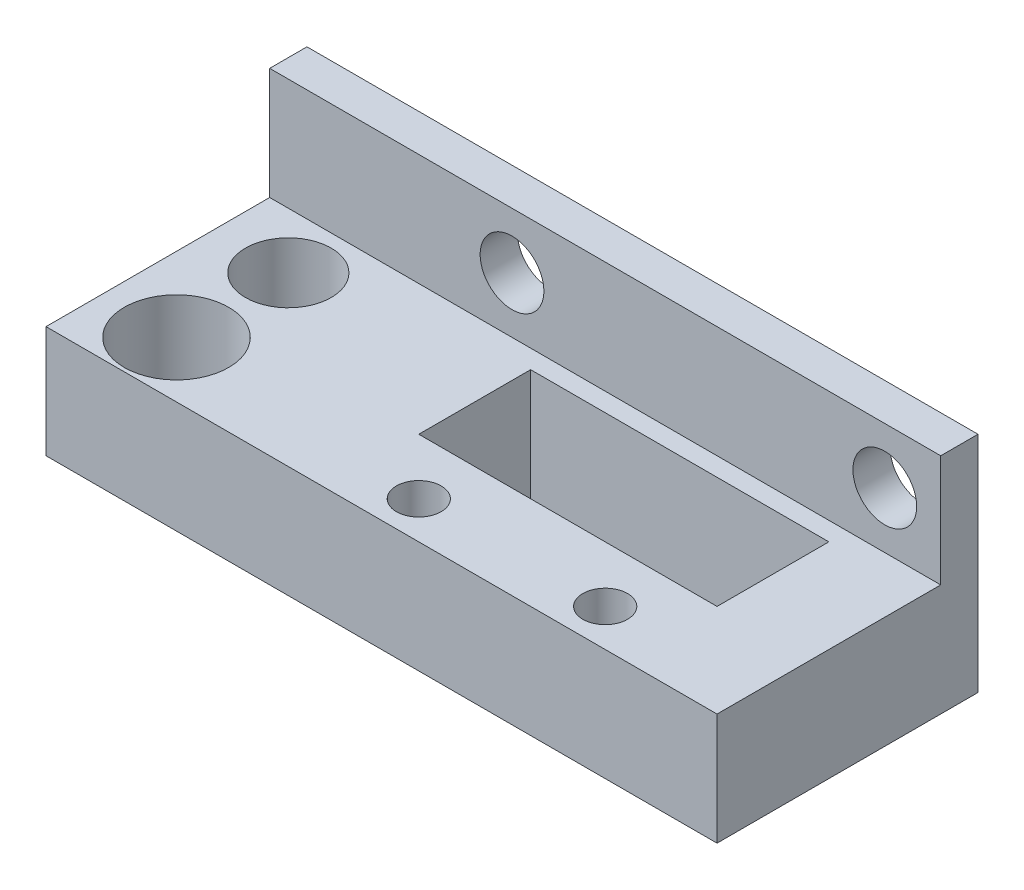
ISO-10303-21;
HEADER;
FILE_DESCRIPTION(('STEP AP214'),'2;1');
FILE_NAME('part.step','',(''),(''),'','','');
FILE_SCHEMA(('AUTOMOTIVE_DESIGN { 1 0 10303 214 1 1 1 1 }'));
ENDSEC;
DATA;
#1=APPLICATION_CONTEXT('core data for automotive mechanical design processes');
#2=APPLICATION_PROTOCOL_DEFINITION('international standard','automotive_design',2000,#1);
#3=PRODUCT_CONTEXT('',#1,'mechanical');
#4=PRODUCT('Part','Part','',(#3));
#5=PRODUCT_RELATED_PRODUCT_CATEGORY('part','',(#4));
#6=PRODUCT_DEFINITION_FORMATION('','',#4);
#7=PRODUCT_DEFINITION_CONTEXT('part definition',#1,'design');
#8=PRODUCT_DEFINITION('design','',#6,#7);
#9=PRODUCT_DEFINITION_SHAPE('','',#8);
#10=(LENGTH_UNIT() NAMED_UNIT(*) SI_UNIT(.MILLI.,.METRE.));
#11=(NAMED_UNIT(*) PLANE_ANGLE_UNIT() SI_UNIT($,.RADIAN.));
#12=(NAMED_UNIT(*) SI_UNIT($,.STERADIAN.) SOLID_ANGLE_UNIT());
#13=UNCERTAINTY_MEASURE_WITH_UNIT(LENGTH_MEASURE(1.E-05),#10,'distance_accuracy_value','');
#14=(GEOMETRIC_REPRESENTATION_CONTEXT(3) GLOBAL_UNCERTAINTY_ASSIGNED_CONTEXT((#13)) GLOBAL_UNIT_ASSIGNED_CONTEXT((#10,
#11,#12)) REPRESENTATION_CONTEXT('',''));
#15=CARTESIAN_POINT('',(0.,0.,0.));
#16=DIRECTION('',(0.,0.,1.));
#17=DIRECTION('',(1.,0.,0.));
#18=AXIS2_PLACEMENT_3D('',#15,#16,#17);
#19=CARTESIAN_POINT('',(-30.3244897959184,7.62,-13.1211734693877));
#20=DIRECTION('',(1.,0.,0.));
#21=DIRECTION('',(0.,0.,-1.));
#22=AXIS2_PLACEMENT_3D('',#19,#20,#21);
#23=PLANE('',#22);
#24=DIRECTION('',(0.,0.,1.));
#25=VECTOR('',#24,1.);
#26=CARTESIAN_POINT('',(-30.3244897959184,0.,-13.1211734693877));
#27=LINE('',#26,#25);
#28=CARTESIAN_POINT('',(-30.3244897959184,0.,-13.1211734693877));
#29=VERTEX_POINT('',#28);
#30=CARTESIAN_POINT('',(-30.3244897959184,0.,4.65882653061225));
#31=VERTEX_POINT('',#30);
#32=EDGE_CURVE('E199',#29,#31,#27,.T.);
#33=ORIENTED_EDGE('',*,*,#32,.T.);
#34=DIRECTION('',(0.,-1.,0.));
#35=VECTOR('',#34,1.);
#36=CARTESIAN_POINT('',(-30.3244897959184,7.62,4.65882653061225));
#37=LINE('',#36,#35);
#38=CARTESIAN_POINT('',(-30.3244897959184,7.62,4.65882653061225));
#39=VERTEX_POINT('',#38);
#40=EDGE_CURVE('E11',#39,#31,#37,.T.);
#41=ORIENTED_EDGE('',*,*,#40,.F.);
#42=DIRECTION('',(0.,0.,1.));
#43=VECTOR('',#42,1.);
#44=CARTESIAN_POINT('',(-30.3244897959184,7.62,-13.1211734693877));
#45=LINE('',#44,#43);
#46=CARTESIAN_POINT('',(-30.3244897959184,7.62,-10.5811734693877));
#47=VERTEX_POINT('',#46);
#48=EDGE_CURVE('E200',#47,#39,#45,.T.);
#49=ORIENTED_EDGE('',*,*,#48,.F.);
#50=DIRECTION('',(0.,-1.,0.));
#51=VECTOR('',#50,1.);
#52=CARTESIAN_POINT('',(-30.3244897959184,15.24,-10.5811734693877));
#53=LINE('',#52,#51);
#54=CARTESIAN_POINT('',(-30.3244897959184,15.24,-10.5811734693877));
#55=VERTEX_POINT('',#54);
#56=EDGE_CURVE('E196',#55,#47,#53,.T.);
#57=ORIENTED_EDGE('',*,*,#56,.F.);
#58=DIRECTION('',(0.,0.,1.));
#59=VECTOR('',#58,1.);
#60=CARTESIAN_POINT('',(-30.3244897959184,15.24,-13.1211734693877));
#61=LINE('',#60,#59);
#62=CARTESIAN_POINT('',(-30.3244897959184,15.24,-13.1211734693877));
#63=VERTEX_POINT('',#62);
#64=EDGE_CURVE('E180',#63,#55,#61,.T.);
#65=ORIENTED_EDGE('',*,*,#64,.F.);
#66=DIRECTION('',(0.,-1.,0.));
#67=VECTOR('',#66,1.);
#68=CARTESIAN_POINT('',(-30.3244897959184,7.62,-13.1211734693877));
#69=LINE('',#68,#67);
#70=EDGE_CURVE('E207',#63,#29,#69,.T.);
#71=ORIENTED_EDGE('',*,*,#70,.T.);
#72=EDGE_LOOP('',(#33,#41,#49,#57,#65,#71));
#73=FACE_BOUND('',#72,.T.);
#74=ADVANCED_FACE('F33',(#73),#23,.F.);
#75=CARTESIAN_POINT('',(-30.3244897959184,7.62,4.65882653061225));
#76=DIRECTION('',(0.,0.,-1.));
#77=DIRECTION('',(-1.,0.,0.));
#78=AXIS2_PLACEMENT_3D('',#75,#76,#77);
#79=PLANE('',#78);
#80=DIRECTION('',(1.,0.,0.));
#81=VECTOR('',#80,1.);
#82=CARTESIAN_POINT('',(-30.3244897959184,0.,4.65882653061225));
#83=LINE('',#82,#81);
#84=CARTESIAN_POINT('',(15.3955102040816,0.,4.65882653061225));
#85=VERTEX_POINT('',#84);
#86=EDGE_CURVE('E210',#31,#85,#83,.T.);
#87=ORIENTED_EDGE('',*,*,#86,.T.);
#88=DIRECTION('',(0.,-1.,0.));
#89=VECTOR('',#88,1.);
#90=CARTESIAN_POINT('',(15.3955102040816,7.62,4.65882653061225));
#91=LINE('',#90,#89);
#92=CARTESIAN_POINT('',(15.3955102040816,7.62,4.65882653061225));
#93=VERTEX_POINT('',#92);
#94=EDGE_CURVE('E40',#93,#85,#91,.T.);
#95=ORIENTED_EDGE('',*,*,#94,.F.);
#96=DIRECTION('',(1.,0.,0.));
#97=VECTOR('',#96,1.);
#98=CARTESIAN_POINT('',(-30.3244897959184,7.62,4.65882653061225));
#99=LINE('',#98,#97);
#100=EDGE_CURVE('E202',#39,#93,#99,.T.);
#101=ORIENTED_EDGE('',*,*,#100,.F.);
#102=ORIENTED_EDGE('',*,*,#40,.T.);
#103=EDGE_LOOP('',(#87,#95,#101,#102));
#104=FACE_BOUND('',#103,.T.);
#105=ADVANCED_FACE('F246',(#104),#79,.F.);
#106=CARTESIAN_POINT('',(15.3955102040816,7.62,-13.1211734693877));
#107=DIRECTION('',(-1.,0.,0.));
#108=DIRECTION('',(0.,0.,1.));
#109=AXIS2_PLACEMENT_3D('',#106,#107,#108);
#110=PLANE('',#109);
#111=DIRECTION('',(0.,0.,-1.));
#112=VECTOR('',#111,1.);
#113=CARTESIAN_POINT('',(15.3955102040816,0.,-13.1211734693877));
#114=LINE('',#113,#112);
#115=CARTESIAN_POINT('',(15.3955102040816,0.,-13.1211734693877));
#116=VERTEX_POINT('',#115);
#117=EDGE_CURVE('E212',#85,#116,#114,.T.);
#118=ORIENTED_EDGE('',*,*,#117,.T.);
#119=DIRECTION('',(0.,-1.,0.));
#120=VECTOR('',#119,1.);
#121=CARTESIAN_POINT('',(15.3955102040816,7.62,-13.1211734693877));
#122=LINE('',#121,#120);
#123=CARTESIAN_POINT('',(15.3955102040816,15.24,-13.1211734693877));
#124=VERTEX_POINT('',#123);
#125=EDGE_CURVE('E217',#124,#116,#122,.T.);
#126=ORIENTED_EDGE('',*,*,#125,.F.);
#127=DIRECTION('',(0.,0.,-1.));
#128=VECTOR('',#127,1.);
#129=CARTESIAN_POINT('',(15.3955102040816,15.24,-13.1211734693877));
#130=LINE('',#129,#128);
#131=CARTESIAN_POINT('',(15.3955102040816,15.24,-10.5811734693877));
#132=VERTEX_POINT('',#131);
#133=EDGE_CURVE('E185',#132,#124,#130,.T.);
#134=ORIENTED_EDGE('',*,*,#133,.F.);
#135=DIRECTION('',(0.,-1.,0.));
#136=VECTOR('',#135,1.);
#137=CARTESIAN_POINT('',(15.3955102040816,15.24,-10.5811734693877));
#138=LINE('',#137,#136);
#139=CARTESIAN_POINT('',(15.3955102040816,7.62,-10.5811734693877));
#140=VERTEX_POINT('',#139);
#141=EDGE_CURVE('E191',#132,#140,#138,.T.);
#142=ORIENTED_EDGE('',*,*,#141,.T.);
#143=DIRECTION('',(0.,0.,-1.));
#144=VECTOR('',#143,1.);
#145=CARTESIAN_POINT('',(15.3955102040816,7.62,-13.1211734693877));
#146=LINE('',#145,#144);
#147=EDGE_CURVE('E205',#93,#140,#146,.T.);
#148=ORIENTED_EDGE('',*,*,#147,.F.);
#149=ORIENTED_EDGE('',*,*,#94,.T.);
#150=EDGE_LOOP('',(#118,#126,#134,#142,#148,#149));
#151=FACE_BOUND('',#150,.T.);
#152=ADVANCED_FACE('F224',(#151),#110,.F.);
#153=CARTESIAN_POINT('',(-30.3244897959184,7.62,-13.1211734693877));
#154=DIRECTION('',(0.,0.,1.));
#155=DIRECTION('',(1.,0.,0.));
#156=AXIS2_PLACEMENT_3D('',#153,#154,#155);
#157=PLANE('',#156);
#158=CARTESIAN_POINT('',(-13.8144897959184,11.43,-13.1211734693877));
#159=DIRECTION('',(0.,0.,-1.));
#160=DIRECTION('',(-1.,0.,0.));
#161=AXIS2_PLACEMENT_3D('',#158,#159,#160);
#162=CIRCLE('',#161,2.1717);
#163=CARTESIAN_POINT('',(-15.9861897959184,11.43,-13.1211734693877));
#164=VERTEX_POINT('',#163);
#165=EDGE_CURVE('E172',#164,#164,#162,.T.);
#166=ORIENTED_EDGE('',*,*,#165,.F.);
#167=EDGE_LOOP('',(#166));
#168=FACE_BOUND('',#167,.T.);
#169=CARTESIAN_POINT('',(11.5855102040816,11.43,-13.1211734693877));
#170=DIRECTION('',(0.,0.,-1.));
#171=DIRECTION('',(-1.,0.,0.));
#172=AXIS2_PLACEMENT_3D('',#169,#170,#171);
#173=CIRCLE('',#172,2.1717);
#174=CARTESIAN_POINT('',(9.41381020408164,11.43,-13.1211734693877));
#175=VERTEX_POINT('',#174);
#176=EDGE_CURVE('E165',#175,#175,#173,.T.);
#177=ORIENTED_EDGE('',*,*,#176,.F.);
#178=EDGE_LOOP('',(#177));
#179=FACE_BOUND('',#178,.T.);
#180=DIRECTION('',(-1.,0.,0.));
#181=VECTOR('',#180,1.);
#182=CARTESIAN_POINT('',(-30.3244897959184,0.,-13.1211734693877));
#183=LINE('',#182,#181);
#184=EDGE_CURVE('E203',#116,#29,#183,.T.);
#185=ORIENTED_EDGE('',*,*,#184,.T.);
#186=ORIENTED_EDGE('',*,*,#70,.F.);
#187=DIRECTION('',(-1.,0.,0.));
#188=VECTOR('',#187,1.);
#189=CARTESIAN_POINT('',(-30.3244897959184,15.24,-13.1211734693877));
#190=LINE('',#189,#188);
#191=EDGE_CURVE('E188',#124,#63,#190,.T.);
#192=ORIENTED_EDGE('',*,*,#191,.F.);
#193=ORIENTED_EDGE('',*,*,#125,.T.);
#194=EDGE_LOOP('',(#185,#186,#192,#193));
#195=FACE_BOUND('',#194,.T.);
#196=ADVANCED_FACE('F231',(#168,#179,#195),#157,.F.);
#197=CARTESIAN_POINT('',(0.,7.62,0.));
#198=DIRECTION('',(0.,1.,0.));
#199=DIRECTION('',(0.,0.,1.));
#200=AXIS2_PLACEMENT_3D('',#197,#198,#199);
#201=PLANE('',#200);
#202=CARTESIAN_POINT('',(-25.2444897959184,7.62,-6.77117346938775));
#203=DIRECTION('',(0.,1.,0.));
#204=DIRECTION('',(0.,0.,1.));
#205=AXIS2_PLACEMENT_3D('',#202,#203,#204);
#206=CIRCLE('',#205,2.921);
#207=CARTESIAN_POINT('',(-25.2444897959184,7.62,-3.85017346938775));
#208=VERTEX_POINT('',#207);
#209=EDGE_CURVE('E152',#208,#208,#206,.T.);
#210=ORIENTED_EDGE('',*,*,#209,.F.);
#211=EDGE_LOOP('',(#210));
#212=FACE_BOUND('',#211,.T.);
#213=CARTESIAN_POINT('',(-7.46448979591836,7.62,2.11882653061225));
#214=DIRECTION('',(0.,1.,0.));
#215=DIRECTION('',(0.,0.,1.));
#216=AXIS2_PLACEMENT_3D('',#213,#214,#215);
#217=CIRCLE('',#216,1.524);
#218=CARTESIAN_POINT('',(-7.46448979591836,7.62,3.64282653061225));
#219=VERTEX_POINT('',#218);
#220=EDGE_CURVE('E158',#219,#219,#217,.T.);
#221=ORIENTED_EDGE('',*,*,#220,.F.);
#222=EDGE_LOOP('',(#221));
#223=FACE_BOUND('',#222,.T.);
#224=CARTESIAN_POINT('',(5.23551020408164,7.62,2.11882653061225));
#225=DIRECTION('',(0.,1.,0.));
#226=DIRECTION('',(0.,0.,1.));
#227=AXIS2_PLACEMENT_3D('',#224,#225,#226);
#228=CIRCLE('',#227,1.524);
#229=CARTESIAN_POINT('',(5.23551020408164,7.62,3.64282653061225));
#230=VERTEX_POINT('',#229);
#231=EDGE_CURVE('E133',#230,#230,#228,.T.);
#232=ORIENTED_EDGE('',*,*,#231,.F.);
#233=EDGE_LOOP('',(#232));
#234=FACE_BOUND('',#233,.T.);
#235=DIRECTION('',(0.,0.,1.));
#236=VECTOR('',#235,1.);
#237=CARTESIAN_POINT('',(-11.2744897959184,7.62,-9.31117346938775));
#238=LINE('',#237,#236);
#239=CARTESIAN_POINT('',(-11.2744897959184,7.62,-9.31117346938775));
#240=VERTEX_POINT('',#239);
#241=CARTESIAN_POINT('',(-11.2744897959184,7.62,-1.69117346938775));
#242=VERTEX_POINT('',#241);
#243=EDGE_CURVE('E47',#240,#242,#238,.T.);
#244=ORIENTED_EDGE('',*,*,#243,.F.);
#245=DIRECTION('',(-1.,0.,0.));
#246=VECTOR('',#245,1.);
#247=CARTESIAN_POINT('',(-11.2744897959184,7.62,-9.31117346938775));
#248=LINE('',#247,#246);
#249=CARTESIAN_POINT('',(9.04551020408164,7.62,-9.31117346938775));
#250=VERTEX_POINT('',#249);
#251=EDGE_CURVE('E127',#250,#240,#248,.T.);
#252=ORIENTED_EDGE('',*,*,#251,.F.);
#253=DIRECTION('',(0.,0.,-1.));
#254=VECTOR('',#253,1.);
#255=CARTESIAN_POINT('',(9.04551020408164,7.62,-9.31117346938775));
#256=LINE('',#255,#254);
#257=CARTESIAN_POINT('',(9.04551020408164,7.62,-1.69117346938775));
#258=VERTEX_POINT('',#257);
#259=EDGE_CURVE('E130',#258,#250,#256,.T.);
#260=ORIENTED_EDGE('',*,*,#259,.F.);
#261=DIRECTION('',(1.,0.,0.));
#262=VECTOR('',#261,1.);
#263=CARTESIAN_POINT('',(-11.2744897959184,7.62,-1.69117346938775));
#264=LINE('',#263,#262);
#265=EDGE_CURVE('E139',#242,#258,#264,.T.);
#266=ORIENTED_EDGE('',*,*,#265,.F.);
#267=EDGE_LOOP('',(#244,#252,#260,#266));
#268=FACE_BOUND('',#267,.T.);
#269=CARTESIAN_POINT('',(-25.2444897959184,7.62,0.848826530612249));
#270=DIRECTION('',(0.,1.,0.));
#271=DIRECTION('',(0.,0.,1.));
#272=AXIS2_PLACEMENT_3D('',#269,#270,#271);
#273=CIRCLE('',#272,3.556);
#274=CARTESIAN_POINT('',(-25.2444897959184,7.62,4.40482653061225));
#275=VERTEX_POINT('',#274);
#276=EDGE_CURVE('E151',#275,#275,#273,.T.);
#277=ORIENTED_EDGE('',*,*,#276,.F.);
#278=EDGE_LOOP('',(#277));
#279=FACE_BOUND('',#278,.T.);
#280=DIRECTION('',(1.,0.,0.));
#281=VECTOR('',#280,1.);
#282=CARTESIAN_POINT('',(-30.3244897959184,7.62,-10.5811734693877));
#283=LINE('',#282,#281);
#284=EDGE_CURVE('E171',#47,#140,#283,.T.);
#285=ORIENTED_EDGE('',*,*,#284,.F.);
#286=ORIENTED_EDGE('',*,*,#48,.T.);
#287=ORIENTED_EDGE('',*,*,#100,.T.);
#288=ORIENTED_EDGE('',*,*,#147,.T.);
#289=EDGE_LOOP('',(#285,#286,#287,#288));
#290=FACE_BOUND('',#289,.T.);
#291=ADVANCED_FACE('F245',(#212,#223,#234,#268,#279,#290),#201,.T.);
#292=CARTESIAN_POINT('',(0.,0.,0.));
#293=DIRECTION('',(0.,1.,0.));
#294=DIRECTION('',(0.,0.,1.));
#295=AXIS2_PLACEMENT_3D('',#292,#293,#294);
#296=PLANE('',#295);
#297=CARTESIAN_POINT('',(-25.2444897959184,0.,-6.77117346938775));
#298=DIRECTION('',(0.,1.,0.));
#299=DIRECTION('',(0.,0.,1.));
#300=AXIS2_PLACEMENT_3D('',#297,#298,#299);
#301=CIRCLE('',#300,2.921);
#302=CARTESIAN_POINT('',(-25.2444897959184,0.,-3.85017346938775));
#303=VERTEX_POINT('',#302);
#304=EDGE_CURVE('E148',#303,#303,#301,.T.);
#305=ORIENTED_EDGE('',*,*,#304,.T.);
#306=EDGE_LOOP('',(#305));
#307=FACE_BOUND('',#306,.T.);
#308=CARTESIAN_POINT('',(-7.46448979591836,0.,2.11882653061225));
#309=DIRECTION('',(0.,1.,0.));
#310=DIRECTION('',(0.,0.,1.));
#311=AXIS2_PLACEMENT_3D('',#308,#309,#310);
#312=CIRCLE('',#311,1.524);
#313=CARTESIAN_POINT('',(-7.46448979591836,0.,3.64282653061225));
#314=VERTEX_POINT('',#313);
#315=EDGE_CURVE('E155',#314,#314,#312,.T.);
#316=ORIENTED_EDGE('',*,*,#315,.T.);
#317=EDGE_LOOP('',(#316));
#318=FACE_BOUND('',#317,.T.);
#319=CARTESIAN_POINT('',(5.23551020408164,0.,2.11882653061225));
#320=DIRECTION('',(0.,1.,0.));
#321=DIRECTION('',(0.,0.,1.));
#322=AXIS2_PLACEMENT_3D('',#319,#320,#321);
#323=CIRCLE('',#322,1.524);
#324=CARTESIAN_POINT('',(5.23551020408164,0.,3.64282653061225));
#325=VERTEX_POINT('',#324);
#326=EDGE_CURVE('E161',#325,#325,#323,.T.);
#327=ORIENTED_EDGE('',*,*,#326,.T.);
#328=EDGE_LOOP('',(#327));
#329=FACE_BOUND('',#328,.T.);
#330=DIRECTION('',(-1.,0.,0.));
#331=VECTOR('',#330,1.);
#332=CARTESIAN_POINT('',(-11.2744897959184,0.,-9.31117346938775));
#333=LINE('',#332,#331);
#334=CARTESIAN_POINT('',(9.04551020408164,0.,-9.31117346938775));
#335=VERTEX_POINT('',#334);
#336=CARTESIAN_POINT('',(-11.2744897959184,0.,-9.31117346938775));
#337=VERTEX_POINT('',#336);
#338=EDGE_CURVE('E117',#335,#337,#333,.T.);
#339=ORIENTED_EDGE('',*,*,#338,.T.);
#340=DIRECTION('',(0.,0.,1.));
#341=VECTOR('',#340,1.);
#342=CARTESIAN_POINT('',(-11.2744897959184,0.,-9.31117346938775));
#343=LINE('',#342,#341);
#344=CARTESIAN_POINT('',(-11.2744897959184,0.,-1.69117346938775));
#345=VERTEX_POINT('',#344);
#346=EDGE_CURVE('E111',#337,#345,#343,.T.);
#347=ORIENTED_EDGE('',*,*,#346,.T.);
#348=DIRECTION('',(1.,0.,0.));
#349=VECTOR('',#348,1.);
#350=CARTESIAN_POINT('',(-11.2744897959184,0.,-1.69117346938775));
#351=LINE('',#350,#349);
#352=CARTESIAN_POINT('',(9.04551020408164,0.,-1.69117346938775));
#353=VERTEX_POINT('',#352);
#354=EDGE_CURVE('E120',#345,#353,#351,.T.);
#355=ORIENTED_EDGE('',*,*,#354,.T.);
#356=DIRECTION('',(0.,0.,-1.));
#357=VECTOR('',#356,1.);
#358=CARTESIAN_POINT('',(9.04551020408164,0.,-9.31117346938775));
#359=LINE('',#358,#357);
#360=EDGE_CURVE('E55',#353,#335,#359,.T.);
#361=ORIENTED_EDGE('',*,*,#360,.T.);
#362=EDGE_LOOP('',(#339,#347,#355,#361));
#363=FACE_BOUND('',#362,.T.);
#364=CARTESIAN_POINT('',(-25.2444897959184,0.,0.848826530612249));
#365=DIRECTION('',(0.,1.,0.));
#366=DIRECTION('',(0.,0.,1.));
#367=AXIS2_PLACEMENT_3D('',#364,#365,#366);
#368=CIRCLE('',#367,3.556);
#369=CARTESIAN_POINT('',(-25.2444897959184,0.,4.40482653061225));
#370=VERTEX_POINT('',#369);
#371=EDGE_CURVE('E162',#370,#370,#368,.T.);
#372=ORIENTED_EDGE('',*,*,#371,.T.);
#373=EDGE_LOOP('',(#372));
#374=FACE_BOUND('',#373,.T.);
#375=ORIENTED_EDGE('',*,*,#32,.F.);
#376=ORIENTED_EDGE('',*,*,#184,.F.);
#377=ORIENTED_EDGE('',*,*,#117,.F.);
#378=ORIENTED_EDGE('',*,*,#86,.F.);
#379=EDGE_LOOP('',(#375,#376,#377,#378));
#380=FACE_BOUND('',#379,.T.);
#381=ADVANCED_FACE('F124',(#307,#318,#329,#363,#374,#380),#296,.F.);
#382=CARTESIAN_POINT('',(-30.3244897959184,15.24,-10.5811734693877));
#383=DIRECTION('',(0.,0.,-1.));
#384=DIRECTION('',(-1.,0.,0.));
#385=AXIS2_PLACEMENT_3D('',#382,#383,#384);
#386=PLANE('',#385);
#387=CARTESIAN_POINT('',(-13.8144897959184,11.43,-10.5811734693877));
#388=DIRECTION('',(0.,0.,-1.));
#389=DIRECTION('',(-1.,0.,0.));
#390=AXIS2_PLACEMENT_3D('',#387,#388,#389);
#391=CIRCLE('',#390,2.1717);
#392=CARTESIAN_POINT('',(-15.9861897959184,11.43,-10.5811734693877));
#393=VERTEX_POINT('',#392);
#394=EDGE_CURVE('E168',#393,#393,#391,.T.);
#395=ORIENTED_EDGE('',*,*,#394,.T.);
#396=EDGE_LOOP('',(#395));
#397=FACE_BOUND('',#396,.T.);
#398=CARTESIAN_POINT('',(11.5855102040816,11.43,-10.5811734693877));
#399=DIRECTION('',(0.,0.,-1.));
#400=DIRECTION('',(-1.,0.,0.));
#401=AXIS2_PLACEMENT_3D('',#398,#399,#400);
#402=CIRCLE('',#401,2.1717);
#403=CARTESIAN_POINT('',(9.41381020408164,11.43,-10.5811734693877));
#404=VERTEX_POINT('',#403);
#405=EDGE_CURVE('E175',#404,#404,#402,.T.);
#406=ORIENTED_EDGE('',*,*,#405,.T.);
#407=EDGE_LOOP('',(#406));
#408=FACE_BOUND('',#407,.T.);
#409=ORIENTED_EDGE('',*,*,#284,.T.);
#410=ORIENTED_EDGE('',*,*,#141,.F.);
#411=DIRECTION('',(1.,0.,0.));
#412=VECTOR('',#411,1.);
#413=CARTESIAN_POINT('',(-30.3244897959184,15.24,-10.5811734693877));
#414=LINE('',#413,#412);
#415=EDGE_CURVE('E183',#55,#132,#414,.T.);
#416=ORIENTED_EDGE('',*,*,#415,.F.);
#417=ORIENTED_EDGE('',*,*,#56,.T.);
#418=EDGE_LOOP('',(#409,#410,#416,#417));
#419=FACE_BOUND('',#418,.T.);
#420=ADVANCED_FACE('F243',(#397,#408,#419),#386,.F.);
#421=CARTESIAN_POINT('',(0.,15.24,0.));
#422=DIRECTION('',(0.,1.,0.));
#423=DIRECTION('',(0.,0.,1.));
#424=AXIS2_PLACEMENT_3D('',#421,#422,#423);
#425=PLANE('',#424);
#426=ORIENTED_EDGE('',*,*,#64,.T.);
#427=ORIENTED_EDGE('',*,*,#415,.T.);
#428=ORIENTED_EDGE('',*,*,#133,.T.);
#429=ORIENTED_EDGE('',*,*,#191,.T.);
#430=EDGE_LOOP('',(#426,#427,#428,#429));
#431=FACE_BOUND('',#430,.T.);
#432=ADVANCED_FACE('F239',(#431),#425,.T.);
#433=CARTESIAN_POINT('',(11.5855102040816,11.43,-10.5811734693877));
#434=DIRECTION('',(0.,0.,-1.));
#435=DIRECTION('',(-1.,0.,0.));
#436=AXIS2_PLACEMENT_3D('',#433,#434,#435);
#437=CYLINDRICAL_SURFACE('',#436,2.1717);
#438=ORIENTED_EDGE('',*,*,#405,.F.);
#439=EDGE_LOOP('',(#438));
#440=FACE_BOUND('',#439,.T.);
#441=ORIENTED_EDGE('',*,*,#176,.T.);
#442=EDGE_LOOP('',(#441));
#443=FACE_BOUND('',#442,.T.);
#444=ADVANCED_FACE('F268',(#440,#443),#437,.F.);
#445=CARTESIAN_POINT('',(-13.8144897959184,11.43,-10.5811734693877));
#446=DIRECTION('',(0.,0.,-1.));
#447=DIRECTION('',(-1.,0.,0.));
#448=AXIS2_PLACEMENT_3D('',#445,#446,#447);
#449=CYLINDRICAL_SURFACE('',#448,2.1717);
#450=ORIENTED_EDGE('',*,*,#394,.F.);
#451=EDGE_LOOP('',(#450));
#452=FACE_BOUND('',#451,.T.);
#453=ORIENTED_EDGE('',*,*,#165,.T.);
#454=EDGE_LOOP('',(#453));
#455=FACE_BOUND('',#454,.T.);
#456=ADVANCED_FACE('F271',(#452,#455),#449,.F.);
#457=CARTESIAN_POINT('',(-25.2444897959184,0.,0.848826530612249));
#458=DIRECTION('',(0.,1.,0.));
#459=DIRECTION('',(0.,0.,1.));
#460=AXIS2_PLACEMENT_3D('',#457,#458,#459);
#461=CYLINDRICAL_SURFACE('',#460,3.556);
#462=CARTESIAN_POINT('',(-25.2444897959184,0.,4.40482653061225));
#463=CARTESIAN_POINT('',(-25.2444897959184,0.0793749999999998,4.40482653061225));
#464=CARTESIAN_POINT('',(-25.2444897959184,0.15875,4.40482653061225));
#465=CARTESIAN_POINT('',(-25.2444897959184,0.3175,4.40482653061225));
#466=CARTESIAN_POINT('',(-25.2444897959184,0.396875,4.40482653061225));
#467=CARTESIAN_POINT('',(-25.2444897959184,0.555625,4.40482653061225));
#468=CARTESIAN_POINT('',(-25.2444897959184,0.635,4.40482653061225));
#469=CARTESIAN_POINT('',(-25.2444897959184,0.79375,4.40482653061225));
#470=CARTESIAN_POINT('',(-25.2444897959184,0.873125,4.40482653061225));
#471=CARTESIAN_POINT('',(-25.2444897959184,1.031875,4.40482653061225));
#472=CARTESIAN_POINT('',(-25.2444897959184,1.11125,4.40482653061225));
#473=CARTESIAN_POINT('',(-25.2444897959184,1.27,4.40482653061225));
#474=CARTESIAN_POINT('',(-25.2444897959184,1.349375,4.40482653061225));
#475=CARTESIAN_POINT('',(-25.2444897959184,1.508125,4.40482653061225));
#476=CARTESIAN_POINT('',(-25.2444897959184,1.5875,4.40482653061225));
#477=CARTESIAN_POINT('',(-25.2444897959184,1.74625,4.40482653061225));
#478=CARTESIAN_POINT('',(-25.2444897959184,1.825625,4.40482653061225));
#479=CARTESIAN_POINT('',(-25.2444897959184,1.984375,4.40482653061225));
#480=CARTESIAN_POINT('',(-25.2444897959184,2.06375,4.40482653061225));
#481=CARTESIAN_POINT('',(-25.2444897959184,2.2225,4.40482653061225));
#482=CARTESIAN_POINT('',(-25.2444897959184,2.301875,4.40482653061225));
#483=CARTESIAN_POINT('',(-25.2444897959184,2.460625,4.40482653061225));
#484=CARTESIAN_POINT('',(-25.2444897959184,2.54,4.40482653061225));
#485=CARTESIAN_POINT('',(-25.2444897959184,2.69875,4.40482653061225));
#486=CARTESIAN_POINT('',(-25.2444897959184,2.778125,4.40482653061225));
#487=CARTESIAN_POINT('',(-25.2444897959184,2.936875,4.40482653061225));
#488=CARTESIAN_POINT('',(-25.2444897959184,3.01625,4.40482653061225));
#489=CARTESIAN_POINT('',(-25.2444897959184,3.175,4.40482653061225));
#490=CARTESIAN_POINT('',(-25.2444897959184,3.254375,4.40482653061225));
#491=CARTESIAN_POINT('',(-25.2444897959184,3.413125,4.40482653061225));
#492=CARTESIAN_POINT('',(-25.2444897959184,3.4925,4.40482653061225));
#493=CARTESIAN_POINT('',(-25.2444897959184,3.65125,4.40482653061225));
#494=CARTESIAN_POINT('',(-25.2444897959184,3.730625,4.40482653061225));
#495=CARTESIAN_POINT('',(-25.2444897959184,3.889375,4.40482653061225));
#496=CARTESIAN_POINT('',(-25.2444897959184,3.96875,4.40482653061225));
#497=CARTESIAN_POINT('',(-25.2444897959184,4.1275,4.40482653061225));
#498=CARTESIAN_POINT('',(-25.2444897959184,4.206875,4.40482653061225));
#499=CARTESIAN_POINT('',(-25.2444897959184,4.365625,4.40482653061225));
#500=CARTESIAN_POINT('',(-25.2444897959184,4.445,4.40482653061225));
#501=CARTESIAN_POINT('',(-25.2444897959184,4.60375,4.40482653061225));
#502=CARTESIAN_POINT('',(-25.2444897959184,4.683125,4.40482653061225));
#503=CARTESIAN_POINT('',(-25.2444897959184,4.841875,4.40482653061225));
#504=CARTESIAN_POINT('',(-25.2444897959184,4.92125,4.40482653061225));
#505=CARTESIAN_POINT('',(-25.2444897959184,5.08,4.40482653061225));
#506=CARTESIAN_POINT('',(-25.2444897959184,5.159375,4.40482653061225));
#507=CARTESIAN_POINT('',(-25.2444897959184,5.318125,4.40482653061225));
#508=CARTESIAN_POINT('',(-25.2444897959184,5.3975,4.40482653061225));
#509=CARTESIAN_POINT('',(-25.2444897959184,5.55625,4.40482653061225));
#510=CARTESIAN_POINT('',(-25.2444897959184,5.635625,4.40482653061225));
#511=CARTESIAN_POINT('',(-25.2444897959184,5.794375,4.40482653061225));
#512=CARTESIAN_POINT('',(-25.2444897959184,5.87375,4.40482653061225));
#513=CARTESIAN_POINT('',(-25.2444897959184,6.0325,4.40482653061225));
#514=CARTESIAN_POINT('',(-25.2444897959184,6.111875,4.40482653061225));
#515=CARTESIAN_POINT('',(-25.2444897959184,6.270625,4.40482653061225));
#516=CARTESIAN_POINT('',(-25.2444897959184,6.35,4.40482653061225));
#517=CARTESIAN_POINT('',(-25.2444897959184,6.50875,4.40482653061225));
#518=CARTESIAN_POINT('',(-25.2444897959184,6.588125,4.40482653061225));
#519=CARTESIAN_POINT('',(-25.2444897959184,6.746875,4.40482653061225));
#520=CARTESIAN_POINT('',(-25.2444897959184,6.82625,4.40482653061225));
#521=CARTESIAN_POINT('',(-25.2444897959184,6.985,4.40482653061225));
#522=CARTESIAN_POINT('',(-25.2444897959184,7.064375,4.40482653061225));
#523=CARTESIAN_POINT('',(-25.2444897959184,7.223125,4.40482653061225));
#524=CARTESIAN_POINT('',(-25.2444897959184,7.3025,4.40482653061225));
#525=CARTESIAN_POINT('',(-25.2444897959184,7.46125,4.40482653061225));
#526=CARTESIAN_POINT('',(-25.2444897959184,7.540625,4.40482653061225));
#527=CARTESIAN_POINT('',(-25.2444897959184,7.62,4.40482653061225));
#528=B_SPLINE_CURVE_WITH_KNOTS('',3,(#462,#463,#464,#465,#466,#467,#468,#469,#470,#471,#472,
#473,#474,#475,#476,#477,#478,#479,#480,#481,#482,#483,#484,#485,#486,#487,#488,#489,#490,#491,
#492,#493,#494,#495,#496,#497,#498,#499,#500,#501,#502,#503,#504,#505,#506,#507,#508,#509,#510,
#511,#512,#513,#514,#515,#516,#517,#518,#519,#520,#521,#522,#523,#524,#525,#526,#527),
.UNSPECIFIED.,.F.,.F.,(4,2,2,2,2,2,2,2,2,2,2,2,2,2,2,2,2,2,2,2,2,2,2,2,2,2,2,2,2,2,2,2,4),(0.,
0.238125,0.47625,0.714375,0.9525,1.190625,1.42875,1.666875,1.905,2.143125,2.38125,2.619375,
2.8575,3.095625,3.33375,3.571875,3.81,4.048125,4.28625,4.524375,4.7625,5.000625,5.23875,
5.476875,5.715,5.953125,6.19125,6.429375,6.6675,6.905625,7.14375,7.381875,7.62),.UNSPECIFIED.);
#529=EDGE_CURVE('BSEAM275',#370,#275,#528,.T.);
#530=ORIENTED_EDGE('',*,*,#371,.F.);
#531=ORIENTED_EDGE('',*,*,#276,.T.);
#532=ORIENTED_EDGE('',*,*,#529,.T.);
#533=ORIENTED_EDGE('',*,*,#529,.F.);
#534=EDGE_LOOP('',(#530,#532,#531,#533));
#535=FACE_BOUND('',#534,.T.);
#536=ADVANCED_FACE('F275',(#535),#461,.F.);
#537=CARTESIAN_POINT('',(-11.2744897959184,0.,-9.31117346938775));
#538=DIRECTION('',(-1.,0.,0.));
#539=DIRECTION('',(0.,0.,1.));
#540=AXIS2_PLACEMENT_3D('',#537,#538,#539);
#541=PLANE('',#540);
#542=ORIENTED_EDGE('',*,*,#243,.T.);
#543=DIRECTION('',(0.,1.,0.));
#544=VECTOR('',#543,1.);
#545=CARTESIAN_POINT('',(-11.2744897959184,0.,-1.69117346938775));
#546=LINE('',#545,#544);
#547=EDGE_CURVE('E107',#345,#242,#546,.T.);
#548=ORIENTED_EDGE('',*,*,#547,.F.);
#549=ORIENTED_EDGE('',*,*,#346,.F.);
#550=DIRECTION('',(0.,1.,0.));
#551=VECTOR('',#550,1.);
#552=CARTESIAN_POINT('',(-11.2744897959184,0.,-9.31117346938775));
#553=LINE('',#552,#551);
#554=EDGE_CURVE('E143',#337,#240,#553,.T.);
#555=ORIENTED_EDGE('',*,*,#554,.T.);
#556=EDGE_LOOP('',(#542,#548,#549,#555));
#557=FACE_BOUND('',#556,.T.);
#558=ADVANCED_FACE('F109',(#557),#541,.F.);
#559=CARTESIAN_POINT('',(-11.2744897959184,0.,-9.31117346938775));
#560=DIRECTION('',(0.,0.,-1.));
#561=DIRECTION('',(-1.,0.,0.));
#562=AXIS2_PLACEMENT_3D('',#559,#560,#561);
#563=PLANE('',#562);
#564=ORIENTED_EDGE('',*,*,#251,.T.);
#565=ORIENTED_EDGE('',*,*,#554,.F.);
#566=ORIENTED_EDGE('',*,*,#338,.F.);
#567=DIRECTION('',(0.,1.,0.));
#568=VECTOR('',#567,1.);
#569=CARTESIAN_POINT('',(9.04551020408164,0.,-9.31117346938775));
#570=LINE('',#569,#568);
#571=EDGE_CURVE('E145',#335,#250,#570,.T.);
#572=ORIENTED_EDGE('',*,*,#571,.T.);
#573=EDGE_LOOP('',(#564,#565,#566,#572));
#574=FACE_BOUND('',#573,.T.);
#575=ADVANCED_FACE('F291',(#574),#563,.F.);
#576=CARTESIAN_POINT('',(9.04551020408164,0.,-9.31117346938775));
#577=DIRECTION('',(1.,0.,0.));
#578=DIRECTION('',(0.,0.,-1.));
#579=AXIS2_PLACEMENT_3D('',#576,#577,#578);
#580=PLANE('',#579);
#581=ORIENTED_EDGE('',*,*,#259,.T.);
#582=ORIENTED_EDGE('',*,*,#571,.F.);
#583=ORIENTED_EDGE('',*,*,#360,.F.);
#584=DIRECTION('',(0.,1.,0.));
#585=VECTOR('',#584,1.);
#586=CARTESIAN_POINT('',(9.04551020408164,0.,-1.69117346938775));
#587=LINE('',#586,#585);
#588=EDGE_CURVE('E116',#353,#258,#587,.T.);
#589=ORIENTED_EDGE('',*,*,#588,.T.);
#590=EDGE_LOOP('',(#581,#582,#583,#589));
#591=FACE_BOUND('',#590,.T.);
#592=ADVANCED_FACE('F294',(#591),#580,.F.);
#593=CARTESIAN_POINT('',(-11.2744897959184,0.,-1.69117346938775));
#594=DIRECTION('',(0.,0.,1.));
#595=DIRECTION('',(1.,0.,0.));
#596=AXIS2_PLACEMENT_3D('',#593,#594,#595);
#597=PLANE('',#596);
#598=ORIENTED_EDGE('',*,*,#265,.T.);
#599=ORIENTED_EDGE('',*,*,#588,.F.);
#600=ORIENTED_EDGE('',*,*,#354,.F.);
#601=ORIENTED_EDGE('',*,*,#547,.T.);
#602=EDGE_LOOP('',(#598,#599,#600,#601));
#603=FACE_BOUND('',#602,.T.);
#604=ADVANCED_FACE('F121',(#603),#597,.F.);
#605=CARTESIAN_POINT('',(5.23551020408164,0.,2.11882653061225));
#606=DIRECTION('',(0.,1.,0.));
#607=DIRECTION('',(0.,0.,1.));
#608=AXIS2_PLACEMENT_3D('',#605,#606,#607);
#609=CYLINDRICAL_SURFACE('',#608,1.524);
#610=CARTESIAN_POINT('',(5.23551020408164,0.,3.64282653061225));
#611=CARTESIAN_POINT('',(5.23551020408164,0.0793749999999998,3.64282653061225));
#612=CARTESIAN_POINT('',(5.23551020408164,0.15875,3.64282653061225));
#613=CARTESIAN_POINT('',(5.23551020408164,0.3175,3.64282653061225));
#614=CARTESIAN_POINT('',(5.23551020408164,0.396875,3.64282653061225));
#615=CARTESIAN_POINT('',(5.23551020408164,0.555625,3.64282653061225));
#616=CARTESIAN_POINT('',(5.23551020408164,0.635,3.64282653061225));
#617=CARTESIAN_POINT('',(5.23551020408164,0.79375,3.64282653061225));
#618=CARTESIAN_POINT('',(5.23551020408164,0.873125,3.64282653061225));
#619=CARTESIAN_POINT('',(5.23551020408164,1.031875,3.64282653061225));
#620=CARTESIAN_POINT('',(5.23551020408164,1.11125,3.64282653061225));
#621=CARTESIAN_POINT('',(5.23551020408164,1.27,3.64282653061225));
#622=CARTESIAN_POINT('',(5.23551020408164,1.349375,3.64282653061225));
#623=CARTESIAN_POINT('',(5.23551020408164,1.508125,3.64282653061225));
#624=CARTESIAN_POINT('',(5.23551020408164,1.5875,3.64282653061225));
#625=CARTESIAN_POINT('',(5.23551020408164,1.74625,3.64282653061225));
#626=CARTESIAN_POINT('',(5.23551020408164,1.825625,3.64282653061225));
#627=CARTESIAN_POINT('',(5.23551020408164,1.984375,3.64282653061225));
#628=CARTESIAN_POINT('',(5.23551020408164,2.06375,3.64282653061225));
#629=CARTESIAN_POINT('',(5.23551020408164,2.2225,3.64282653061225));
#630=CARTESIAN_POINT('',(5.23551020408164,2.301875,3.64282653061225));
#631=CARTESIAN_POINT('',(5.23551020408164,2.460625,3.64282653061225));
#632=CARTESIAN_POINT('',(5.23551020408164,2.54,3.64282653061225));
#633=CARTESIAN_POINT('',(5.23551020408164,2.69875,3.64282653061225));
#634=CARTESIAN_POINT('',(5.23551020408164,2.778125,3.64282653061225));
#635=CARTESIAN_POINT('',(5.23551020408164,2.936875,3.64282653061225));
#636=CARTESIAN_POINT('',(5.23551020408164,3.01625,3.64282653061225));
#637=CARTESIAN_POINT('',(5.23551020408164,3.175,3.64282653061225));
#638=CARTESIAN_POINT('',(5.23551020408164,3.254375,3.64282653061225));
#639=CARTESIAN_POINT('',(5.23551020408164,3.413125,3.64282653061225));
#640=CARTESIAN_POINT('',(5.23551020408164,3.4925,3.64282653061225));
#641=CARTESIAN_POINT('',(5.23551020408164,3.65125,3.64282653061225));
#642=CARTESIAN_POINT('',(5.23551020408164,3.730625,3.64282653061225));
#643=CARTESIAN_POINT('',(5.23551020408164,3.889375,3.64282653061225));
#644=CARTESIAN_POINT('',(5.23551020408164,3.96875,3.64282653061225));
#645=CARTESIAN_POINT('',(5.23551020408164,4.1275,3.64282653061225));
#646=CARTESIAN_POINT('',(5.23551020408164,4.206875,3.64282653061225));
#647=CARTESIAN_POINT('',(5.23551020408164,4.365625,3.64282653061225));
#648=CARTESIAN_POINT('',(5.23551020408164,4.445,3.64282653061225));
#649=CARTESIAN_POINT('',(5.23551020408164,4.60375,3.64282653061225));
#650=CARTESIAN_POINT('',(5.23551020408164,4.683125,3.64282653061225));
#651=CARTESIAN_POINT('',(5.23551020408164,4.841875,3.64282653061225));
#652=CARTESIAN_POINT('',(5.23551020408164,4.92125,3.64282653061225));
#653=CARTESIAN_POINT('',(5.23551020408164,5.08,3.64282653061225));
#654=CARTESIAN_POINT('',(5.23551020408164,5.159375,3.64282653061225));
#655=CARTESIAN_POINT('',(5.23551020408164,5.318125,3.64282653061225));
#656=CARTESIAN_POINT('',(5.23551020408164,5.3975,3.64282653061225));
#657=CARTESIAN_POINT('',(5.23551020408164,5.55625,3.64282653061225));
#658=CARTESIAN_POINT('',(5.23551020408164,5.635625,3.64282653061225));
#659=CARTESIAN_POINT('',(5.23551020408164,5.794375,3.64282653061225));
#660=CARTESIAN_POINT('',(5.23551020408164,5.87375,3.64282653061225));
#661=CARTESIAN_POINT('',(5.23551020408164,6.0325,3.64282653061225));
#662=CARTESIAN_POINT('',(5.23551020408164,6.111875,3.64282653061225));
#663=CARTESIAN_POINT('',(5.23551020408164,6.270625,3.64282653061225));
#664=CARTESIAN_POINT('',(5.23551020408164,6.35,3.64282653061225));
#665=CARTESIAN_POINT('',(5.23551020408164,6.50875,3.64282653061225));
#666=CARTESIAN_POINT('',(5.23551020408164,6.588125,3.64282653061225));
#667=CARTESIAN_POINT('',(5.23551020408164,6.746875,3.64282653061225));
#668=CARTESIAN_POINT('',(5.23551020408164,6.82625,3.64282653061225));
#669=CARTESIAN_POINT('',(5.23551020408164,6.985,3.64282653061225));
#670=CARTESIAN_POINT('',(5.23551020408164,7.064375,3.64282653061225));
#671=CARTESIAN_POINT('',(5.23551020408164,7.223125,3.64282653061225));
#672=CARTESIAN_POINT('',(5.23551020408164,7.3025,3.64282653061225));
#673=CARTESIAN_POINT('',(5.23551020408164,7.46125,3.64282653061225));
#674=CARTESIAN_POINT('',(5.23551020408164,7.540625,3.64282653061225));
#675=CARTESIAN_POINT('',(5.23551020408164,7.62,3.64282653061225));
#676=B_SPLINE_CURVE_WITH_KNOTS('',3,(#610,#611,#612,#613,#614,#615,#616,#617,#618,#619,#620,
#621,#622,#623,#624,#625,#626,#627,#628,#629,#630,#631,#632,#633,#634,#635,#636,#637,#638,#639,
#640,#641,#642,#643,#644,#645,#646,#647,#648,#649,#650,#651,#652,#653,#654,#655,#656,#657,#658,
#659,#660,#661,#662,#663,#664,#665,#666,#667,#668,#669,#670,#671,#672,#673,#674,#675),
.UNSPECIFIED.,.F.,.F.,(4,2,2,2,2,2,2,2,2,2,2,2,2,2,2,2,2,2,2,2,2,2,2,2,2,2,2,2,2,2,2,2,4),(0.,
0.238125,0.47625,0.714375,0.9525,1.190625,1.42875,1.666875,1.905,2.143125,2.38125,2.619375,
2.8575,3.095625,3.33375,3.571875,3.81,4.048125,4.28625,4.524375,4.7625,5.000625,5.23875,
5.476875,5.715,5.953125,6.19125,6.429375,6.6675,6.905625,7.14375,7.381875,7.62),.UNSPECIFIED.);
#677=EDGE_CURVE('BSEAM284',#325,#230,#676,.T.);
#678=ORIENTED_EDGE('',*,*,#326,.F.);
#679=ORIENTED_EDGE('',*,*,#231,.T.);
#680=ORIENTED_EDGE('',*,*,#677,.T.);
#681=ORIENTED_EDGE('',*,*,#677,.F.);
#682=EDGE_LOOP('',(#678,#680,#679,#681));
#683=FACE_BOUND('',#682,.T.);
#684=ADVANCED_FACE('F284',(#683),#609,.F.);
#685=CARTESIAN_POINT('',(-7.46448979591836,0.,2.11882653061225));
#686=DIRECTION('',(0.,1.,0.));
#687=DIRECTION('',(0.,0.,1.));
#688=AXIS2_PLACEMENT_3D('',#685,#686,#687);
#689=CYLINDRICAL_SURFACE('',#688,1.524);
#690=CARTESIAN_POINT('',(-7.46448979591836,0.,3.64282653061225));
#691=CARTESIAN_POINT('',(-7.46448979591836,0.0793749999999998,3.64282653061225));
#692=CARTESIAN_POINT('',(-7.46448979591836,0.15875,3.64282653061225));
#693=CARTESIAN_POINT('',(-7.46448979591836,0.3175,3.64282653061225));
#694=CARTESIAN_POINT('',(-7.46448979591836,0.396875,3.64282653061225));
#695=CARTESIAN_POINT('',(-7.46448979591836,0.555625,3.64282653061225));
#696=CARTESIAN_POINT('',(-7.46448979591836,0.635,3.64282653061225));
#697=CARTESIAN_POINT('',(-7.46448979591836,0.79375,3.64282653061225));
#698=CARTESIAN_POINT('',(-7.46448979591836,0.873125,3.64282653061225));
#699=CARTESIAN_POINT('',(-7.46448979591836,1.031875,3.64282653061225));
#700=CARTESIAN_POINT('',(-7.46448979591836,1.11125,3.64282653061225));
#701=CARTESIAN_POINT('',(-7.46448979591836,1.27,3.64282653061225));
#702=CARTESIAN_POINT('',(-7.46448979591836,1.349375,3.64282653061225));
#703=CARTESIAN_POINT('',(-7.46448979591836,1.508125,3.64282653061225));
#704=CARTESIAN_POINT('',(-7.46448979591836,1.5875,3.64282653061225));
#705=CARTESIAN_POINT('',(-7.46448979591836,1.74625,3.64282653061225));
#706=CARTESIAN_POINT('',(-7.46448979591836,1.825625,3.64282653061225));
#707=CARTESIAN_POINT('',(-7.46448979591836,1.984375,3.64282653061225));
#708=CARTESIAN_POINT('',(-7.46448979591836,2.06375,3.64282653061225));
#709=CARTESIAN_POINT('',(-7.46448979591836,2.2225,3.64282653061225));
#710=CARTESIAN_POINT('',(-7.46448979591836,2.301875,3.64282653061225));
#711=CARTESIAN_POINT('',(-7.46448979591836,2.460625,3.64282653061225));
#712=CARTESIAN_POINT('',(-7.46448979591836,2.54,3.64282653061225));
#713=CARTESIAN_POINT('',(-7.46448979591836,2.69875,3.64282653061225));
#714=CARTESIAN_POINT('',(-7.46448979591836,2.778125,3.64282653061225));
#715=CARTESIAN_POINT('',(-7.46448979591836,2.936875,3.64282653061225));
#716=CARTESIAN_POINT('',(-7.46448979591836,3.01625,3.64282653061225));
#717=CARTESIAN_POINT('',(-7.46448979591836,3.175,3.64282653061225));
#718=CARTESIAN_POINT('',(-7.46448979591836,3.254375,3.64282653061225));
#719=CARTESIAN_POINT('',(-7.46448979591836,3.413125,3.64282653061225));
#720=CARTESIAN_POINT('',(-7.46448979591836,3.4925,3.64282653061225));
#721=CARTESIAN_POINT('',(-7.46448979591836,3.65125,3.64282653061225));
#722=CARTESIAN_POINT('',(-7.46448979591836,3.730625,3.64282653061225));
#723=CARTESIAN_POINT('',(-7.46448979591836,3.889375,3.64282653061225));
#724=CARTESIAN_POINT('',(-7.46448979591836,3.96875,3.64282653061225));
#725=CARTESIAN_POINT('',(-7.46448979591836,4.1275,3.64282653061225));
#726=CARTESIAN_POINT('',(-7.46448979591836,4.206875,3.64282653061225));
#727=CARTESIAN_POINT('',(-7.46448979591836,4.365625,3.64282653061225));
#728=CARTESIAN_POINT('',(-7.46448979591836,4.445,3.64282653061225));
#729=CARTESIAN_POINT('',(-7.46448979591836,4.60375,3.64282653061225));
#730=CARTESIAN_POINT('',(-7.46448979591836,4.683125,3.64282653061225));
#731=CARTESIAN_POINT('',(-7.46448979591836,4.841875,3.64282653061225));
#732=CARTESIAN_POINT('',(-7.46448979591836,4.92125,3.64282653061225));
#733=CARTESIAN_POINT('',(-7.46448979591836,5.08,3.64282653061225));
#734=CARTESIAN_POINT('',(-7.46448979591836,5.159375,3.64282653061225));
#735=CARTESIAN_POINT('',(-7.46448979591836,5.318125,3.64282653061225));
#736=CARTESIAN_POINT('',(-7.46448979591836,5.3975,3.64282653061225));
#737=CARTESIAN_POINT('',(-7.46448979591836,5.55625,3.64282653061225));
#738=CARTESIAN_POINT('',(-7.46448979591836,5.635625,3.64282653061225));
#739=CARTESIAN_POINT('',(-7.46448979591836,5.794375,3.64282653061225));
#740=CARTESIAN_POINT('',(-7.46448979591836,5.87375,3.64282653061225));
#741=CARTESIAN_POINT('',(-7.46448979591836,6.0325,3.64282653061225));
#742=CARTESIAN_POINT('',(-7.46448979591836,6.111875,3.64282653061225));
#743=CARTESIAN_POINT('',(-7.46448979591836,6.270625,3.64282653061225));
#744=CARTESIAN_POINT('',(-7.46448979591836,6.35,3.64282653061225));
#745=CARTESIAN_POINT('',(-7.46448979591836,6.50875,3.64282653061225));
#746=CARTESIAN_POINT('',(-7.46448979591836,6.588125,3.64282653061225));
#747=CARTESIAN_POINT('',(-7.46448979591836,6.746875,3.64282653061225));
#748=CARTESIAN_POINT('',(-7.46448979591836,6.82625,3.64282653061225));
#749=CARTESIAN_POINT('',(-7.46448979591836,6.985,3.64282653061225));
#750=CARTESIAN_POINT('',(-7.46448979591836,7.064375,3.64282653061225));
#751=CARTESIAN_POINT('',(-7.46448979591836,7.223125,3.64282653061225));
#752=CARTESIAN_POINT('',(-7.46448979591836,7.3025,3.64282653061225));
#753=CARTESIAN_POINT('',(-7.46448979591836,7.46125,3.64282653061225));
#754=CARTESIAN_POINT('',(-7.46448979591836,7.540625,3.64282653061225));
#755=CARTESIAN_POINT('',(-7.46448979591836,7.62,3.64282653061225));
#756=B_SPLINE_CURVE_WITH_KNOTS('',3,(#690,#691,#692,#693,#694,#695,#696,#697,#698,#699,#700,
#701,#702,#703,#704,#705,#706,#707,#708,#709,#710,#711,#712,#713,#714,#715,#716,#717,#718,#719,
#720,#721,#722,#723,#724,#725,#726,#727,#728,#729,#730,#731,#732,#733,#734,#735,#736,#737,#738,
#739,#740,#741,#742,#743,#744,#745,#746,#747,#748,#749,#750,#751,#752,#753,#754,#755),
.UNSPECIFIED.,.F.,.F.,(4,2,2,2,2,2,2,2,2,2,2,2,2,2,2,2,2,2,2,2,2,2,2,2,2,2,2,2,2,2,2,2,4),(0.,
0.238125,0.47625,0.714375,0.9525,1.190625,1.42875,1.666875,1.905,2.143125,2.38125,2.619375,
2.8575,3.095625,3.33375,3.571875,3.81,4.048125,4.28625,4.524375,4.7625,5.000625,5.23875,
5.476875,5.715,5.953125,6.19125,6.429375,6.6675,6.905625,7.14375,7.381875,7.62),.UNSPECIFIED.);
#757=EDGE_CURVE('BSEAM280',#314,#219,#756,.T.);
#758=ORIENTED_EDGE('',*,*,#315,.F.);
#759=ORIENTED_EDGE('',*,*,#220,.T.);
#760=ORIENTED_EDGE('',*,*,#757,.T.);
#761=ORIENTED_EDGE('',*,*,#757,.F.);
#762=EDGE_LOOP('',(#758,#760,#759,#761));
#763=FACE_BOUND('',#762,.T.);
#764=ADVANCED_FACE('F280',(#763),#689,.F.);
#765=CARTESIAN_POINT('',(-25.2444897959184,0.,-6.77117346938775));
#766=DIRECTION('',(0.,1.,0.));
#767=DIRECTION('',(0.,0.,1.));
#768=AXIS2_PLACEMENT_3D('',#765,#766,#767);
#769=CYLINDRICAL_SURFACE('',#768,2.921);
#770=CARTESIAN_POINT('',(-25.2444897959184,0.,-3.85017346938775));
#771=CARTESIAN_POINT('',(-25.2444897959184,0.0793749999999998,-3.85017346938775));
#772=CARTESIAN_POINT('',(-25.2444897959184,0.15875,-3.85017346938775));
#773=CARTESIAN_POINT('',(-25.2444897959184,0.3175,-3.85017346938775));
#774=CARTESIAN_POINT('',(-25.2444897959184,0.396875,-3.85017346938775));
#775=CARTESIAN_POINT('',(-25.2444897959184,0.555625,-3.85017346938775));
#776=CARTESIAN_POINT('',(-25.2444897959184,0.635,-3.85017346938775));
#777=CARTESIAN_POINT('',(-25.2444897959184,0.79375,-3.85017346938775));
#778=CARTESIAN_POINT('',(-25.2444897959184,0.873125,-3.85017346938775));
#779=CARTESIAN_POINT('',(-25.2444897959184,1.031875,-3.85017346938775));
#780=CARTESIAN_POINT('',(-25.2444897959184,1.11125,-3.85017346938775));
#781=CARTESIAN_POINT('',(-25.2444897959184,1.27,-3.85017346938775));
#782=CARTESIAN_POINT('',(-25.2444897959184,1.349375,-3.85017346938775));
#783=CARTESIAN_POINT('',(-25.2444897959184,1.508125,-3.85017346938775));
#784=CARTESIAN_POINT('',(-25.2444897959184,1.5875,-3.85017346938775));
#785=CARTESIAN_POINT('',(-25.2444897959184,1.74625,-3.85017346938775));
#786=CARTESIAN_POINT('',(-25.2444897959184,1.825625,-3.85017346938775));
#787=CARTESIAN_POINT('',(-25.2444897959184,1.984375,-3.85017346938775));
#788=CARTESIAN_POINT('',(-25.2444897959184,2.06375,-3.85017346938775));
#789=CARTESIAN_POINT('',(-25.2444897959184,2.2225,-3.85017346938775));
#790=CARTESIAN_POINT('',(-25.2444897959184,2.301875,-3.85017346938775));
#791=CARTESIAN_POINT('',(-25.2444897959184,2.460625,-3.85017346938775));
#792=CARTESIAN_POINT('',(-25.2444897959184,2.54,-3.85017346938775));
#793=CARTESIAN_POINT('',(-25.2444897959184,2.69875,-3.85017346938775));
#794=CARTESIAN_POINT('',(-25.2444897959184,2.778125,-3.85017346938775));
#795=CARTESIAN_POINT('',(-25.2444897959184,2.936875,-3.85017346938775));
#796=CARTESIAN_POINT('',(-25.2444897959184,3.01625,-3.85017346938775));
#797=CARTESIAN_POINT('',(-25.2444897959184,3.175,-3.85017346938775));
#798=CARTESIAN_POINT('',(-25.2444897959184,3.254375,-3.85017346938775));
#799=CARTESIAN_POINT('',(-25.2444897959184,3.413125,-3.85017346938775));
#800=CARTESIAN_POINT('',(-25.2444897959184,3.4925,-3.85017346938775));
#801=CARTESIAN_POINT('',(-25.2444897959184,3.65125,-3.85017346938775));
#802=CARTESIAN_POINT('',(-25.2444897959184,3.730625,-3.85017346938775));
#803=CARTESIAN_POINT('',(-25.2444897959184,3.889375,-3.85017346938775));
#804=CARTESIAN_POINT('',(-25.2444897959184,3.96875,-3.85017346938775));
#805=CARTESIAN_POINT('',(-25.2444897959184,4.1275,-3.85017346938775));
#806=CARTESIAN_POINT('',(-25.2444897959184,4.206875,-3.85017346938775));
#807=CARTESIAN_POINT('',(-25.2444897959184,4.365625,-3.85017346938775));
#808=CARTESIAN_POINT('',(-25.2444897959184,4.445,-3.85017346938775));
#809=CARTESIAN_POINT('',(-25.2444897959184,4.60375,-3.85017346938775));
#810=CARTESIAN_POINT('',(-25.2444897959184,4.683125,-3.85017346938775));
#811=CARTESIAN_POINT('',(-25.2444897959184,4.841875,-3.85017346938775));
#812=CARTESIAN_POINT('',(-25.2444897959184,4.92125,-3.85017346938775));
#813=CARTESIAN_POINT('',(-25.2444897959184,5.08,-3.85017346938775));
#814=CARTESIAN_POINT('',(-25.2444897959184,5.159375,-3.85017346938775));
#815=CARTESIAN_POINT('',(-25.2444897959184,5.318125,-3.85017346938775));
#816=CARTESIAN_POINT('',(-25.2444897959184,5.3975,-3.85017346938775));
#817=CARTESIAN_POINT('',(-25.2444897959184,5.55625,-3.85017346938775));
#818=CARTESIAN_POINT('',(-25.2444897959184,5.635625,-3.85017346938775));
#819=CARTESIAN_POINT('',(-25.2444897959184,5.794375,-3.85017346938775));
#820=CARTESIAN_POINT('',(-25.2444897959184,5.87375,-3.85017346938775));
#821=CARTESIAN_POINT('',(-25.2444897959184,6.0325,-3.85017346938775));
#822=CARTESIAN_POINT('',(-25.2444897959184,6.111875,-3.85017346938775));
#823=CARTESIAN_POINT('',(-25.2444897959184,6.270625,-3.85017346938775));
#824=CARTESIAN_POINT('',(-25.2444897959184,6.35,-3.85017346938775));
#825=CARTESIAN_POINT('',(-25.2444897959184,6.50875,-3.85017346938775));
#826=CARTESIAN_POINT('',(-25.2444897959184,6.588125,-3.85017346938775));
#827=CARTESIAN_POINT('',(-25.2444897959184,6.746875,-3.85017346938775));
#828=CARTESIAN_POINT('',(-25.2444897959184,6.82625,-3.85017346938775));
#829=CARTESIAN_POINT('',(-25.2444897959184,6.985,-3.85017346938775));
#830=CARTESIAN_POINT('',(-25.2444897959184,7.064375,-3.85017346938775));
#831=CARTESIAN_POINT('',(-25.2444897959184,7.223125,-3.85017346938775));
#832=CARTESIAN_POINT('',(-25.2444897959184,7.3025,-3.85017346938775));
#833=CARTESIAN_POINT('',(-25.2444897959184,7.46125,-3.85017346938775));
#834=CARTESIAN_POINT('',(-25.2444897959184,7.540625,-3.85017346938775));
#835=CARTESIAN_POINT('',(-25.2444897959184,7.62,-3.85017346938775));
#836=B_SPLINE_CURVE_WITH_KNOTS('',3,(#770,#771,#772,#773,#774,#775,#776,#777,#778,#779,#780,
#781,#782,#783,#784,#785,#786,#787,#788,#789,#790,#791,#792,#793,#794,#795,#796,#797,#798,#799,
#800,#801,#802,#803,#804,#805,#806,#807,#808,#809,#810,#811,#812,#813,#814,#815,#816,#817,#818,
#819,#820,#821,#822,#823,#824,#825,#826,#827,#828,#829,#830,#831,#832,#833,#834,#835),
.UNSPECIFIED.,.F.,.F.,(4,2,2,2,2,2,2,2,2,2,2,2,2,2,2,2,2,2,2,2,2,2,2,2,2,2,2,2,2,2,2,2,4),(0.,
0.238125,0.47625,0.714375,0.9525,1.190625,1.42875,1.666875,1.905,2.143125,2.38125,2.619375,
2.8575,3.095625,3.33375,3.571875,3.81,4.048125,4.28625,4.524375,4.7625,5.000625,5.23875,
5.476875,5.715,5.953125,6.19125,6.429375,6.6675,6.905625,7.14375,7.381875,7.62),.UNSPECIFIED.);
#837=EDGE_CURVE('BSEAM283',#303,#208,#836,.T.);
#838=ORIENTED_EDGE('',*,*,#304,.F.);
#839=ORIENTED_EDGE('',*,*,#209,.T.);
#840=ORIENTED_EDGE('',*,*,#837,.T.);
#841=ORIENTED_EDGE('',*,*,#837,.F.);
#842=EDGE_LOOP('',(#838,#840,#839,#841));
#843=FACE_BOUND('',#842,.T.);
#844=ADVANCED_FACE('F283',(#843),#769,.F.);
#845=CLOSED_SHELL('',(#74,#105,#152,#196,#291,#381,#420,#432,#444,#456,#536,#558,#575,#592,#604,
#684,#764,#844));
#846=MANIFOLD_SOLID_BREP('B2',#845);
#847=ADVANCED_BREP_SHAPE_REPRESENTATION('',(#18,#846),#14);
#848=SHAPE_DEFINITION_REPRESENTATION(#9,#847);
ENDSEC;
END-ISO-10303-21;
